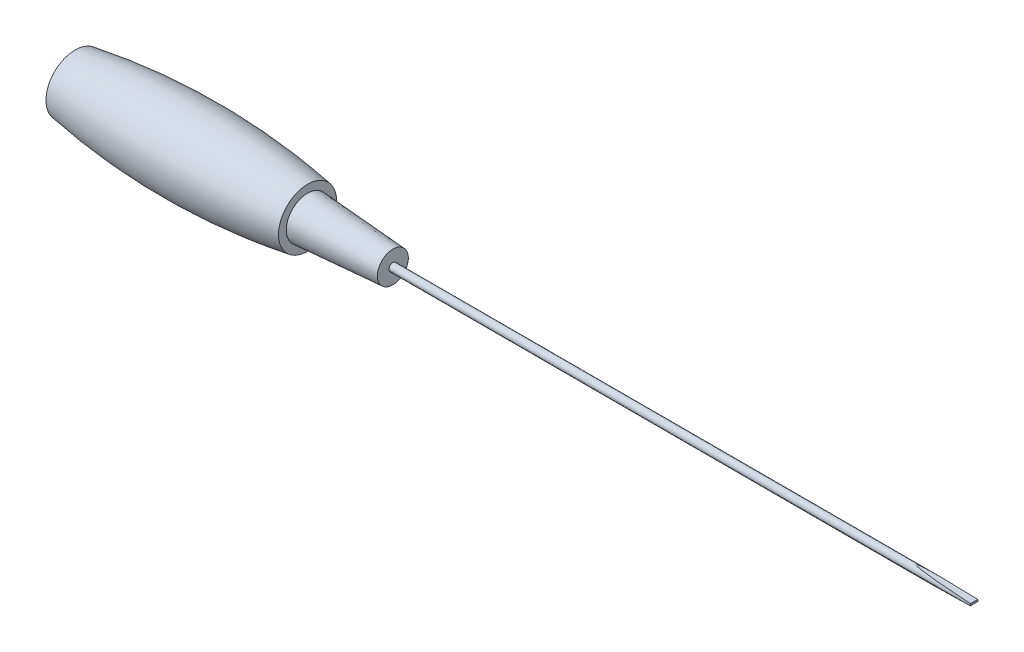
ISO-10303-21;
HEADER;
FILE_DESCRIPTION(('STEP AP214'),'2;1');
FILE_NAME('part.step','',(''),(''),'','','');
FILE_SCHEMA(('AUTOMOTIVE_DESIGN { 1 0 10303 214 1 1 1 1 }'));
ENDSEC;
DATA;
#1=APPLICATION_CONTEXT('core data for automotive mechanical design processes');
#2=APPLICATION_PROTOCOL_DEFINITION('international standard','automotive_design',2000,#1);
#3=PRODUCT_CONTEXT('',#1,'mechanical');
#4=PRODUCT('Part','Part','',(#3));
#5=PRODUCT_RELATED_PRODUCT_CATEGORY('part','',(#4));
#6=PRODUCT_DEFINITION_FORMATION('','',#4);
#7=PRODUCT_DEFINITION_CONTEXT('part definition',#1,'design');
#8=PRODUCT_DEFINITION('design','',#6,#7);
#9=PRODUCT_DEFINITION_SHAPE('','',#8);
#10=(LENGTH_UNIT() NAMED_UNIT(*) SI_UNIT(.MILLI.,.METRE.));
#11=(NAMED_UNIT(*) PLANE_ANGLE_UNIT() SI_UNIT($,.RADIAN.));
#12=(NAMED_UNIT(*) SI_UNIT($,.STERADIAN.) SOLID_ANGLE_UNIT());
#13=UNCERTAINTY_MEASURE_WITH_UNIT(LENGTH_MEASURE(1.E-05),#10,'distance_accuracy_value','');
#14=(GEOMETRIC_REPRESENTATION_CONTEXT(3) GLOBAL_UNCERTAINTY_ASSIGNED_CONTEXT((#13)) GLOBAL_UNIT_ASSIGNED_CONTEXT((#10,
#11,#12)) REPRESENTATION_CONTEXT('',''));
#15=CARTESIAN_POINT('',(0.,0.,0.));
#16=DIRECTION('',(0.,0.,1.));
#17=DIRECTION('',(1.,0.,0.));
#18=AXIS2_PLACEMENT_3D('',#15,#16,#17);
#19=CARTESIAN_POINT('',(-27.0811121743918,-15.0586068318821,0.205505442186086));
#20=DIRECTION('',(0.,-1.,0.));
#21=DIRECTION('',(0.,0.,1.));
#22=AXIS2_PLACEMENT_3D('',#19,#20,#21);
#23=CIRCLE('',#22,8.);
#24=TRIMMED_CURVE('',#23,(PARAMETER_VALUE(-1.59648733310464)),
(PARAMETER_VALUE(1.59648733310464)),.T.,.PARAMETER.);
#25=CARTESIAN_POINT('',(-27.0811121743918,-15.0586068318821,0.));
#26=DIRECTION('',(-1.,0.,0.));
#27=AXIS1_PLACEMENT('',#25,#26);
#28=SURFACE_OF_REVOLUTION('',#24,#27);
#29=CARTESIAN_POINT('',(-35.07847220838,-15.0586068318821,0.));
#30=VERTEX_POINT('',#29);
#31=VERTEX_LOOP('',#30);
#32=FACE_BOUND('',#31,.T.);
#33=CARTESIAN_POINT('',(-33.07847220838,-15.0586068318821,0.));
#34=DIRECTION('',(-1.,0.,0.));
#35=DIRECTION('',(0.,0.,1.));
#36=AXIS2_PLACEMENT_3D('',#33,#34,#35);
#37=CIRCLE('',#36,5.5);
#38=CARTESIAN_POINT('',(-33.07847220838,-15.0586068318821,5.5));
#39=VERTEX_POINT('',#38);
#40=EDGE_CURVE('E94',#39,#39,#37,.T.);
#41=ORIENTED_EDGE('',*,*,#40,.T.);
#42=EDGE_LOOP('',(#41));
#43=FACE_BOUND('',#42,.T.);
#44=ADVANCED_FACE('F45',(#32,#43),#28,.T.);
#45=CARTESIAN_POINT('',(-33.07847220838,-7.55860683188212,0.));
#46=DIRECTION('',(1.,0.,0.));
#47=DIRECTION('',(0.,0.,-1.));
#48=AXIS2_PLACEMENT_3D('',#45,#46,#47);
#49=PLANE('',#48);
#50=ORIENTED_EDGE('',*,*,#40,.F.);
#51=EDGE_LOOP('',(#50));
#52=FACE_BOUND('',#51,.T.);
#53=CARTESIAN_POINT('',(-33.07847220838,-15.0586068318821,0.));
#54=DIRECTION('',(-1.,0.,0.));
#55=DIRECTION('',(0.,0.,1.));
#56=AXIS2_PLACEMENT_3D('',#53,#54,#55);
#57=CIRCLE('',#56,7.49999999999998);
#58=CARTESIAN_POINT('',(-33.07847220838,-15.0586068318821,7.49999999999998));
#59=VERTEX_POINT('',#58);
#60=EDGE_CURVE('E101',#59,#59,#57,.T.);
#61=ORIENTED_EDGE('',*,*,#60,.T.);
#62=EDGE_LOOP('',(#61));
#63=FACE_BOUND('',#62,.T.);
#64=ADVANCED_FACE('F108',(#52,#63),#49,.F.);
#65=CARTESIAN_POINT('',(-3.07847220837997,-15.0586068318821,0.));
#66=DIRECTION('',(-1.,0.,0.));
#67=DIRECTION('',(0.,0.,1.));
#68=AXIS2_PLACEMENT_3D('',#65,#66,#67);
#69=DEGENERATE_TOROIDAL_SURFACE('',#68,175.051362635287,185.,.F.);
#70=ORIENTED_EDGE('',*,*,#60,.F.);
#71=EDGE_LOOP('',(#70));
#72=FACE_BOUND('',#71,.T.);
#73=CARTESIAN_POINT('',(26.92152779162,-15.0586068318821,0.));
#74=DIRECTION('',(-1.,0.,0.));
#75=DIRECTION('',(0.,0.,1.));
#76=AXIS2_PLACEMENT_3D('',#73,#74,#75);
#77=CIRCLE('',#76,7.5);
#78=CARTESIAN_POINT('',(26.92152779162,-15.0586068318821,7.5));
#79=VERTEX_POINT('',#78);
#80=EDGE_CURVE('E98',#79,#79,#77,.T.);
#81=ORIENTED_EDGE('',*,*,#80,.T.);
#82=EDGE_LOOP('',(#81));
#83=FACE_BOUND('',#82,.T.);
#84=ADVANCED_FACE('F111',(#72,#83),#69,.F.);
#85=CARTESIAN_POINT('',(26.92152779162,-7.55860683188212,0.));
#86=DIRECTION('',(-1.,0.,0.));
#87=DIRECTION('',(0.,0.,1.));
#88=AXIS2_PLACEMENT_3D('',#85,#86,#87);
#89=PLANE('',#88);
#90=ORIENTED_EDGE('',*,*,#80,.F.);
#91=EDGE_LOOP('',(#90));
#92=FACE_BOUND('',#91,.T.);
#93=CARTESIAN_POINT('',(26.92152779162,-15.0586068318821,0.));
#94=DIRECTION('',(-1.,0.,0.));
#95=DIRECTION('',(0.,0.,1.));
#96=AXIS2_PLACEMENT_3D('',#93,#94,#95);
#97=CIRCLE('',#96,5.5);
#98=CARTESIAN_POINT('',(26.92152779162,-15.0586068318821,5.5));
#99=VERTEX_POINT('',#98);
#100=EDGE_CURVE('E89',#99,#99,#97,.T.);
#101=ORIENTED_EDGE('',*,*,#100,.T.);
#102=EDGE_LOOP('',(#101));
#103=FACE_BOUND('',#102,.T.);
#104=ADVANCED_FACE('F116',(#92,#103),#89,.F.);
#105=CARTESIAN_POINT('',(48.92152779162,-15.0586068318821,0.));
#106=DIRECTION('',(-1.,0.,0.));
#107=DIRECTION('',(0.,0.,1.));
#108=AXIS2_PLACEMENT_3D('',#105,#106,#107);
#109=CONICAL_SURFACE('',#108,4.,0.0680764582579994);
#110=ORIENTED_EDGE('',*,*,#100,.F.);
#111=EDGE_LOOP('',(#110));
#112=FACE_BOUND('',#111,.T.);
#113=CARTESIAN_POINT('',(48.92152779162,-15.0586068318821,0.));
#114=DIRECTION('',(-1.,0.,0.));
#115=DIRECTION('',(0.,0.,1.));
#116=AXIS2_PLACEMENT_3D('',#113,#114,#115);
#117=CIRCLE('',#116,4.);
#118=CARTESIAN_POINT('',(48.92152779162,-15.0586068318821,4.));
#119=VERTEX_POINT('',#118);
#120=EDGE_CURVE('E86',#119,#119,#117,.T.);
#121=ORIENTED_EDGE('',*,*,#120,.T.);
#122=EDGE_LOOP('',(#121));
#123=FACE_BOUND('',#122,.T.);
#124=ADVANCED_FACE('F122',(#112,#123),#109,.T.);
#125=CARTESIAN_POINT('',(48.92152779162,-11.0586068318821,0.));
#126=DIRECTION('',(-1.,0.,0.));
#127=DIRECTION('',(0.,0.,1.));
#128=AXIS2_PLACEMENT_3D('',#125,#126,#127);
#129=PLANE('',#128);
#130=CARTESIAN_POINT('',(48.92152779162,-15.0586068318821,0.));
#131=DIRECTION('',(1.,0.,0.));
#132=DIRECTION('',(0.,0.,-1.));
#133=AXIS2_PLACEMENT_3D('',#130,#131,#132);
#134=CIRCLE('',#133,1.);
#135=CARTESIAN_POINT('',(48.92152779162,-15.0586068318821,-1.));
#136=VERTEX_POINT('',#135);
#137=EDGE_CURVE('E84',#136,#136,#134,.T.);
#138=ORIENTED_EDGE('',*,*,#137,.F.);
#139=EDGE_LOOP('',(#138));
#140=FACE_BOUND('',#139,.T.);
#141=ORIENTED_EDGE('',*,*,#120,.F.);
#142=EDGE_LOOP('',(#141));
#143=FACE_BOUND('',#142,.T.);
#144=ADVANCED_FACE('F128',(#140,#143),#129,.F.);
#145=CARTESIAN_POINT('',(198.92152779162,-15.0586068318821,0.));
#146=DIRECTION('',(-1.,0.,0.));
#147=DIRECTION('',(0.,0.,1.));
#148=AXIS2_PLACEMENT_3D('',#145,#146,#147);
#149=CYLINDRICAL_SURFACE('',#148,1.);
#150=CARTESIAN_POINT('',(203.92152779162,-15.0586068318821,0.));
#151=DIRECTION('',(-0.049937616943892,-0.998752338877845,0.));
#152=DIRECTION('',(-0.998752338877845,0.049937616943892,0.));
#153=AXIS2_PLACEMENT_3D('',#150,#151,#152);
#154=ELLIPSE('',#153,20.0249843945009,1.);
#155=CARTESIAN_POINT('',(198.92152779162,-14.8086068318821,0.968245836551855));
#156=VERTEX_POINT('',#155);
#157=CARTESIAN_POINT('',(198.92152779162,-14.8086068318821,-0.968245836551855));
#158=VERTEX_POINT('',#157);
#159=EDGE_CURVE('E64',#156,#158,#154,.T.);
#160=ORIENTED_EDGE('',*,*,#159,.T.);
#161=CARTESIAN_POINT('',(198.92152779162,-15.0586068318821,0.));
#162=DIRECTION('',(1.,0.,0.));
#163=DIRECTION('',(0.,0.,-1.));
#164=AXIS2_PLACEMENT_3D('',#161,#162,#163);
#165=CIRCLE('',#164,1.);
#166=CARTESIAN_POINT('',(198.92152779162,-15.3086068318821,-0.968245836551855));
#167=VERTEX_POINT('',#166);
#168=EDGE_CURVE('E80',#167,#158,#165,.T.);
#169=ORIENTED_EDGE('',*,*,#168,.F.);
#170=CARTESIAN_POINT('',(203.92152779162,-15.0586068318821,0.));
#171=DIRECTION('',(-0.0499376169438922,0.998752338877845,0.));
#172=DIRECTION('',(-0.998752338877845,-0.0499376169438922,0.));
#173=AXIS2_PLACEMENT_3D('',#170,#171,#172);
#174=ELLIPSE('',#173,20.0249843945008,1.);
#175=CARTESIAN_POINT('',(198.92152779162,-15.3086068318821,0.968245836551855));
#176=VERTEX_POINT('',#175);
#177=EDGE_CURVE('E58',#167,#176,#174,.T.);
#178=ORIENTED_EDGE('',*,*,#177,.T.);
#179=EDGE_CURVE('E78',#156,#176,#165,.T.);
#180=ORIENTED_EDGE('',*,*,#179,.F.);
#181=EDGE_LOOP('',(#160,#169,#178,#180));
#182=FACE_BOUND('',#181,.T.);
#183=ORIENTED_EDGE('',*,*,#137,.T.);
#184=EDGE_LOOP('',(#183));
#185=FACE_BOUND('',#184,.T.);
#186=ADVANCED_FACE('F75',(#182,#185),#149,.T.);
#187=CARTESIAN_POINT('',(198.92152779162,-15.0586068318821,0.));
#188=DIRECTION('',(1.,0.,0.));
#189=DIRECTION('',(0.,0.,-1.));
#190=AXIS2_PLACEMENT_3D('',#187,#188,#189);
#191=PLANE('',#190);
#192=DIRECTION('',(0.,0.,-1.));
#193=VECTOR('',#192,1.);
#194=CARTESIAN_POINT('',(198.92152779162,-14.8086068318821,0.));
#195=LINE('',#194,#193);
#196=EDGE_CURVE('E13',#156,#158,#195,.T.);
#197=ORIENTED_EDGE('',*,*,#196,.F.);
#198=ORIENTED_EDGE('',*,*,#179,.T.);
#199=DIRECTION('',(0.,0.,1.));
#200=VECTOR('',#199,1.);
#201=CARTESIAN_POINT('',(198.92152779162,-15.3086068318821,0.));
#202=LINE('',#201,#200);
#203=EDGE_CURVE('E52',#167,#176,#202,.T.);
#204=ORIENTED_EDGE('',*,*,#203,.F.);
#205=ORIENTED_EDGE('',*,*,#168,.T.);
#206=EDGE_LOOP('',(#197,#198,#204,#205));
#207=FACE_BOUND('',#206,.T.);
#208=ADVANCED_FACE('F85',(#207),#191,.T.);
#209=CARTESIAN_POINT('',(198.92152779162,-15.3086068318821,-9.94863736471316));
#210=DIRECTION('',(-0.0499376169438922,0.998752338877845,0.));
#211=DIRECTION('',(-0.998752338877845,-0.0499376169438922,0.));
#212=AXIS2_PLACEMENT_3D('',#209,#210,#211);
#213=PLANE('',#212);
#214=ORIENTED_EDGE('',*,*,#177,.F.);
#215=ORIENTED_EDGE('',*,*,#203,.T.);
#216=EDGE_LOOP('',(#214,#215));
#217=FACE_BOUND('',#216,.T.);
#218=ADVANCED_FACE('F82',(#217),#213,.F.);
#219=CARTESIAN_POINT('',(183.92152779162,-14.0586068318821,-9.94863736471316));
#220=DIRECTION('',(-0.049937616943892,-0.998752338877845,0.));
#221=DIRECTION('',(0.998752338877845,-0.049937616943892,0.));
#222=AXIS2_PLACEMENT_3D('',#219,#220,#221);
#223=PLANE('',#222);
#224=ORIENTED_EDGE('',*,*,#159,.F.);
#225=ORIENTED_EDGE('',*,*,#196,.T.);
#226=EDGE_LOOP('',(#224,#225));
#227=FACE_BOUND('',#226,.T.);
#228=ADVANCED_FACE('F187',(#227),#223,.F.);
#229=CLOSED_SHELL('',(#44,#64,#84,#104,#124,#144,#186,#208,#218,#228));
#230=MANIFOLD_SOLID_BREP('B2',#229);
#231=ADVANCED_BREP_SHAPE_REPRESENTATION('',(#18,#230),#14);
#232=SHAPE_DEFINITION_REPRESENTATION(#9,#231);
ENDSEC;
END-ISO-10303-21;
